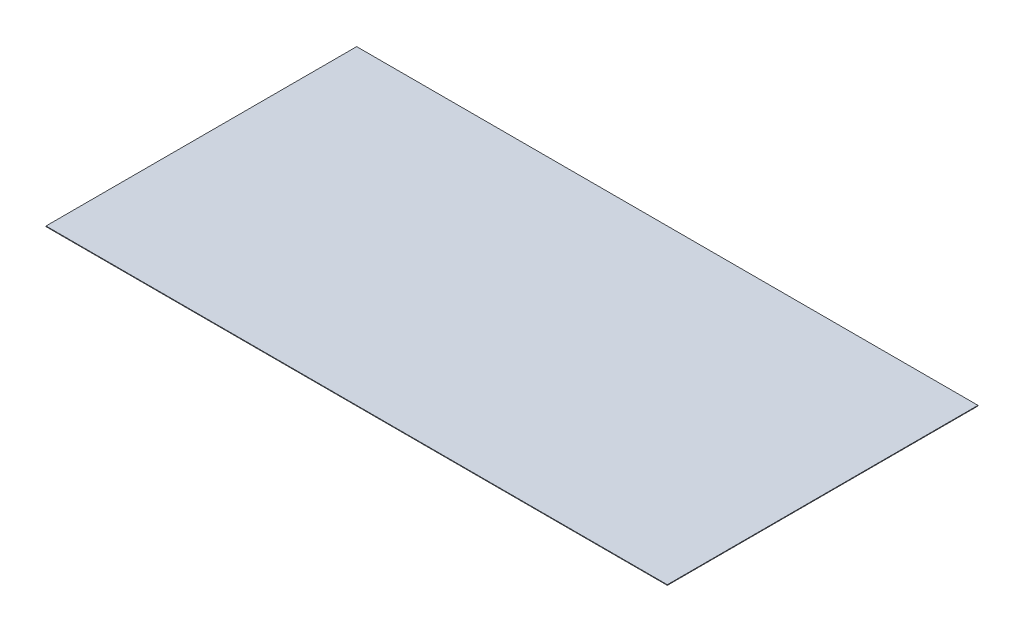
ISO-10303-21;
HEADER;
FILE_DESCRIPTION(('STEP AP214'),'2;1');
FILE_NAME('part.step','',(''),(''),'','','');
FILE_SCHEMA(('AUTOMOTIVE_DESIGN { 1 0 10303 214 1 1 1 1 }'));
ENDSEC;
DATA;
#1=APPLICATION_CONTEXT('core data for automotive mechanical design processes');
#2=APPLICATION_PROTOCOL_DEFINITION('international standard','automotive_design',2000,#1);
#3=PRODUCT_CONTEXT('',#1,'mechanical');
#4=PRODUCT('Part','Part','',(#3));
#5=PRODUCT_RELATED_PRODUCT_CATEGORY('part','',(#4));
#6=PRODUCT_DEFINITION_FORMATION('','',#4);
#7=PRODUCT_DEFINITION_CONTEXT('part definition',#1,'design');
#8=PRODUCT_DEFINITION('design','',#6,#7);
#9=PRODUCT_DEFINITION_SHAPE('','',#8);
#10=(LENGTH_UNIT() NAMED_UNIT(*) SI_UNIT(.MILLI.,.METRE.));
#11=(NAMED_UNIT(*) PLANE_ANGLE_UNIT() SI_UNIT($,.RADIAN.));
#12=(NAMED_UNIT(*) SI_UNIT($,.STERADIAN.) SOLID_ANGLE_UNIT());
#13=UNCERTAINTY_MEASURE_WITH_UNIT(LENGTH_MEASURE(1.E-05),#10,'distance_accuracy_value','');
#14=(GEOMETRIC_REPRESENTATION_CONTEXT(3) GLOBAL_UNCERTAINTY_ASSIGNED_CONTEXT((#13)) GLOBAL_UNIT_ASSIGNED_CONTEXT((#10,
#11,#12)) REPRESENTATION_CONTEXT('',''));
#15=CARTESIAN_POINT('',(0.,0.,0.));
#16=DIRECTION('',(0.,0.,1.));
#17=DIRECTION('',(1.,0.,0.));
#18=AXIS2_PLACEMENT_3D('',#15,#16,#17);
#19=CARTESIAN_POINT('',(-3350.,6.35,1675.));
#20=DIRECTION('',(1.,0.,0.));
#21=DIRECTION('',(0.,0.,-1.));
#22=AXIS2_PLACEMENT_3D('',#19,#20,#21);
#23=PLANE('',#22);
#24=DIRECTION('',(0.,0.,1.));
#25=VECTOR('',#24,1.);
#26=CARTESIAN_POINT('',(-3350.,0.,1675.));
#27=LINE('',#26,#25);
#28=CARTESIAN_POINT('',(-3350.,0.,-1675.));
#29=VERTEX_POINT('',#28);
#30=CARTESIAN_POINT('',(-3350.,0.,1675.));
#31=VERTEX_POINT('',#30);
#32=EDGE_CURVE('E100',#29,#31,#27,.T.);
#33=ORIENTED_EDGE('',*,*,#32,.T.);
#34=DIRECTION('',(0.,-1.,0.));
#35=VECTOR('',#34,1.);
#36=CARTESIAN_POINT('',(-3350.,6.35,1675.));
#37=LINE('',#36,#35);
#38=CARTESIAN_POINT('',(-3350.,6.35,1675.));
#39=VERTEX_POINT('',#38);
#40=EDGE_CURVE('E11',#39,#31,#37,.T.);
#41=ORIENTED_EDGE('',*,*,#40,.F.);
#42=DIRECTION('',(0.,0.,1.));
#43=VECTOR('',#42,1.);
#44=CARTESIAN_POINT('',(-3350.,6.35,1675.));
#45=LINE('',#44,#43);
#46=CARTESIAN_POINT('',(-3350.,6.35,-1675.));
#47=VERTEX_POINT('',#46);
#48=EDGE_CURVE('E88',#47,#39,#45,.T.);
#49=ORIENTED_EDGE('',*,*,#48,.F.);
#50=DIRECTION('',(0.,-1.,0.));
#51=VECTOR('',#50,1.);
#52=CARTESIAN_POINT('',(-3350.,6.35,-1675.));
#53=LINE('',#52,#51);
#54=EDGE_CURVE('E96',#47,#29,#53,.T.);
#55=ORIENTED_EDGE('',*,*,#54,.T.);
#56=EDGE_LOOP('',(#33,#41,#49,#55));
#57=FACE_BOUND('',#56,.T.);
#58=ADVANCED_FACE('F37',(#57),#23,.F.);
#59=CARTESIAN_POINT('',(3350.,6.35,1675.));
#60=DIRECTION('',(0.,0.,-1.));
#61=DIRECTION('',(-1.,0.,0.));
#62=AXIS2_PLACEMENT_3D('',#59,#60,#61);
#63=PLANE('',#62);
#64=DIRECTION('',(1.,0.,0.));
#65=VECTOR('',#64,1.);
#66=CARTESIAN_POINT('',(3350.,0.,1675.));
#67=LINE('',#66,#65);
#68=CARTESIAN_POINT('',(3350.,0.,1675.));
#69=VERTEX_POINT('',#68);
#70=EDGE_CURVE('E92',#31,#69,#67,.T.);
#71=ORIENTED_EDGE('',*,*,#70,.T.);
#72=DIRECTION('',(0.,-1.,0.));
#73=VECTOR('',#72,1.);
#74=CARTESIAN_POINT('',(3350.,6.35,1675.));
#75=LINE('',#74,#73);
#76=CARTESIAN_POINT('',(3350.,6.35,1675.));
#77=VERTEX_POINT('',#76);
#78=EDGE_CURVE('E45',#77,#69,#75,.T.);
#79=ORIENTED_EDGE('',*,*,#78,.F.);
#80=DIRECTION('',(1.,0.,0.));
#81=VECTOR('',#80,1.);
#82=CARTESIAN_POINT('',(3350.,6.35,1675.));
#83=LINE('',#82,#81);
#84=EDGE_CURVE('E83',#39,#77,#83,.T.);
#85=ORIENTED_EDGE('',*,*,#84,.F.);
#86=ORIENTED_EDGE('',*,*,#40,.T.);
#87=EDGE_LOOP('',(#71,#79,#85,#86));
#88=FACE_BOUND('',#87,.T.);
#89=ADVANCED_FACE('F91',(#88),#63,.F.);
#90=CARTESIAN_POINT('',(3350.,6.35,1675.));
#91=DIRECTION('',(-1.,0.,0.));
#92=DIRECTION('',(0.,0.,1.));
#93=AXIS2_PLACEMENT_3D('',#90,#91,#92);
#94=PLANE('',#93);
#95=DIRECTION('',(0.,0.,-1.));
#96=VECTOR('',#95,1.);
#97=CARTESIAN_POINT('',(3350.,0.,1675.));
#98=LINE('',#97,#96);
#99=CARTESIAN_POINT('',(3350.,0.,-1675.));
#100=VERTEX_POINT('',#99);
#101=EDGE_CURVE('E70',#69,#100,#98,.T.);
#102=ORIENTED_EDGE('',*,*,#101,.T.);
#103=DIRECTION('',(0.,-1.,0.));
#104=VECTOR('',#103,1.);
#105=CARTESIAN_POINT('',(3350.,6.35,-1675.));
#106=LINE('',#105,#104);
#107=CARTESIAN_POINT('',(3350.,6.35,-1675.));
#108=VERTEX_POINT('',#107);
#109=EDGE_CURVE('E93',#108,#100,#106,.T.);
#110=ORIENTED_EDGE('',*,*,#109,.F.);
#111=DIRECTION('',(0.,0.,-1.));
#112=VECTOR('',#111,1.);
#113=CARTESIAN_POINT('',(3350.,6.35,1675.));
#114=LINE('',#113,#112);
#115=EDGE_CURVE('E86',#77,#108,#114,.T.);
#116=ORIENTED_EDGE('',*,*,#115,.F.);
#117=ORIENTED_EDGE('',*,*,#78,.T.);
#118=EDGE_LOOP('',(#102,#110,#116,#117));
#119=FACE_BOUND('',#118,.T.);
#120=ADVANCED_FACE('F94',(#119),#94,.F.);
#121=CARTESIAN_POINT('',(3350.,6.35,-1675.));
#122=DIRECTION('',(0.,0.,1.));
#123=DIRECTION('',(1.,0.,0.));
#124=AXIS2_PLACEMENT_3D('',#121,#122,#123);
#125=PLANE('',#124);
#126=DIRECTION('',(-1.,0.,0.));
#127=VECTOR('',#126,1.);
#128=CARTESIAN_POINT('',(3350.,0.,-1675.));
#129=LINE('',#128,#127);
#130=EDGE_CURVE('E76',#100,#29,#129,.T.);
#131=ORIENTED_EDGE('',*,*,#130,.T.);
#132=ORIENTED_EDGE('',*,*,#54,.F.);
#133=DIRECTION('',(-1.,0.,0.));
#134=VECTOR('',#133,1.);
#135=CARTESIAN_POINT('',(3350.,6.35,-1675.));
#136=LINE('',#135,#134);
#137=EDGE_CURVE('E53',#108,#47,#136,.T.);
#138=ORIENTED_EDGE('',*,*,#137,.F.);
#139=ORIENTED_EDGE('',*,*,#109,.T.);
#140=EDGE_LOOP('',(#131,#132,#138,#139));
#141=FACE_BOUND('',#140,.T.);
#142=ADVANCED_FACE('F107',(#141),#125,.F.);
#143=CARTESIAN_POINT('',(0.,6.35,0.));
#144=DIRECTION('',(0.,1.,0.));
#145=DIRECTION('',(0.,0.,1.));
#146=AXIS2_PLACEMENT_3D('',#143,#144,#145);
#147=PLANE('',#146);
#148=ORIENTED_EDGE('',*,*,#48,.T.);
#149=ORIENTED_EDGE('',*,*,#84,.T.);
#150=ORIENTED_EDGE('',*,*,#115,.T.);
#151=ORIENTED_EDGE('',*,*,#137,.T.);
#152=EDGE_LOOP('',(#148,#149,#150,#151));
#153=FACE_BOUND('',#152,.T.);
#154=ADVANCED_FACE('F84',(#153),#147,.T.);
#155=CARTESIAN_POINT('',(0.,0.,0.));
#156=DIRECTION('',(0.,1.,0.));
#157=DIRECTION('',(0.,0.,1.));
#158=AXIS2_PLACEMENT_3D('',#155,#156,#157);
#159=PLANE('',#158);
#160=ORIENTED_EDGE('',*,*,#32,.F.);
#161=ORIENTED_EDGE('',*,*,#130,.F.);
#162=ORIENTED_EDGE('',*,*,#101,.F.);
#163=ORIENTED_EDGE('',*,*,#70,.F.);
#164=EDGE_LOOP('',(#160,#161,#162,#163));
#165=FACE_BOUND('',#164,.T.);
#166=ADVANCED_FACE('F110',(#165),#159,.F.);
#167=CLOSED_SHELL('',(#58,#89,#120,#142,#154,#166));
#168=MANIFOLD_SOLID_BREP('B2',#167);
#169=ADVANCED_BREP_SHAPE_REPRESENTATION('',(#18,#168),#14);
#170=SHAPE_DEFINITION_REPRESENTATION(#9,#169);
ENDSEC;
END-ISO-10303-21;
